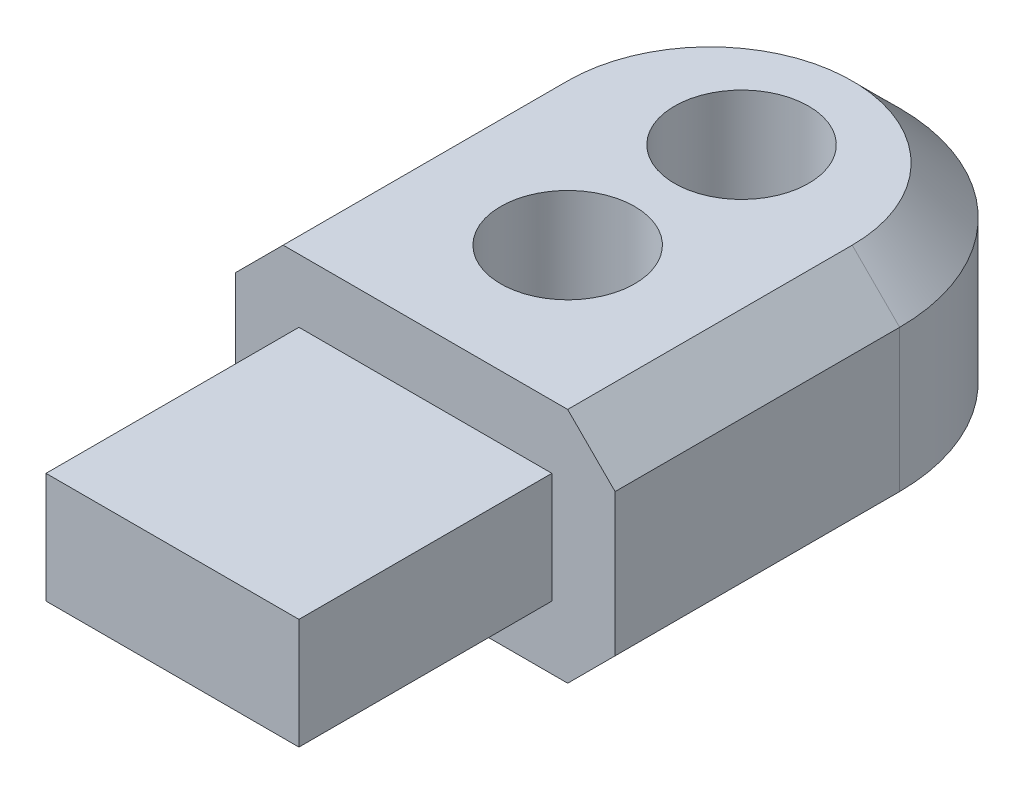
ISO-10303-21;
HEADER;
FILE_DESCRIPTION(('STEP AP214'),'2;1');
FILE_NAME('part.step','',(''),(''),'','','');
FILE_SCHEMA(('AUTOMOTIVE_DESIGN { 1 0 10303 214 1 1 1 1 }'));
ENDSEC;
DATA;
#1=APPLICATION_CONTEXT('core data for automotive mechanical design processes');
#2=APPLICATION_PROTOCOL_DEFINITION('international standard','automotive_design',2000,#1);
#3=PRODUCT_CONTEXT('',#1,'mechanical');
#4=PRODUCT('Part','Part','',(#3));
#5=PRODUCT_RELATED_PRODUCT_CATEGORY('part','',(#4));
#6=PRODUCT_DEFINITION_FORMATION('','',#4);
#7=PRODUCT_DEFINITION_CONTEXT('part definition',#1,'design');
#8=PRODUCT_DEFINITION('design','',#6,#7);
#9=PRODUCT_DEFINITION_SHAPE('','',#8);
#10=(LENGTH_UNIT() NAMED_UNIT(*) SI_UNIT(.MILLI.,.METRE.));
#11=(NAMED_UNIT(*) PLANE_ANGLE_UNIT() SI_UNIT($,.RADIAN.));
#12=(NAMED_UNIT(*) SI_UNIT($,.STERADIAN.) SOLID_ANGLE_UNIT());
#13=UNCERTAINTY_MEASURE_WITH_UNIT(LENGTH_MEASURE(1.E-05),#10,'distance_accuracy_value','');
#14=(GEOMETRIC_REPRESENTATION_CONTEXT(3) GLOBAL_UNCERTAINTY_ASSIGNED_CONTEXT((#13)) GLOBAL_UNIT_ASSIGNED_CONTEXT((#10,
#11,#12)) REPRESENTATION_CONTEXT('',''));
#15=CARTESIAN_POINT('',(0.,0.,0.));
#16=DIRECTION('',(0.,0.,1.));
#17=DIRECTION('',(1.,0.,0.));
#18=AXIS2_PLACEMENT_3D('',#15,#16,#17);
#19=CARTESIAN_POINT('',(7.827828813628,-4.,0.));
#20=DIRECTION('',(-1.,0.,0.));
#21=DIRECTION('',(0.,0.,1.));
#22=AXIS2_PLACEMENT_3D('',#19,#20,#21);
#23=PLANE('',#22);
#24=DIRECTION('',(0.,1.,0.));
#25=VECTOR('',#24,1.);
#26=CARTESIAN_POINT('',(7.827828813628,-4.,29.6199688894745));
#27=LINE('',#26,#25);
#28=CARTESIAN_POINT('',(7.827828813628,-2.5,29.6199688894745));
#29=VERTEX_POINT('',#28);
#30=CARTESIAN_POINT('',(7.827828813628,1.99999999999999,29.6199688894745));
#31=VERTEX_POINT('',#30);
#32=EDGE_CURVE('E170',#29,#31,#27,.T.);
#33=ORIENTED_EDGE('',*,*,#32,.F.);
#34=DIRECTION('',(0.,0.,-1.));
#35=VECTOR('',#34,1.);
#36=CARTESIAN_POINT('',(7.827828813628,-2.5,0.));
#37=LINE('',#36,#35);
#38=CARTESIAN_POINT('',(7.827828813628,-2.5,20.6199688894745));
#39=VERTEX_POINT('',#38);
#40=EDGE_CURVE('E199',#29,#39,#37,.T.);
#41=ORIENTED_EDGE('',*,*,#40,.T.);
#42=DIRECTION('',(0.,1.,0.));
#43=VECTOR('',#42,1.);
#44=CARTESIAN_POINT('',(7.827828813628,-4.,20.6199688894745));
#45=LINE('',#44,#43);
#46=CARTESIAN_POINT('',(7.827828813628,1.99999999999999,20.6199688894745));
#47=VERTEX_POINT('',#46);
#48=EDGE_CURVE('E169',#39,#47,#45,.T.);
#49=ORIENTED_EDGE('',*,*,#48,.T.);
#50=DIRECTION('',(0.,0.,1.));
#51=VECTOR('',#50,1.);
#52=CARTESIAN_POINT('',(7.827828813628,1.99999999999999,29.6199688894745));
#53=LINE('',#52,#51);
#54=EDGE_CURVE('E196',#47,#31,#53,.T.);
#55=ORIENTED_EDGE('',*,*,#54,.T.);
#56=EDGE_LOOP('',(#33,#41,#49,#55));
#57=FACE_BOUND('',#56,.T.);
#58=ADVANCED_FACE('F45',(#57),#23,.F.);
#59=CARTESIAN_POINT('',(0.,-4.,29.6199688894745));
#60=DIRECTION('',(0.,0.,1.));
#61=DIRECTION('',(1.,0.,0.));
#62=AXIS2_PLACEMENT_3D('',#59,#60,#61);
#63=PLANE('',#62);
#64=DIRECTION('',(0.,-1.,0.));
#65=VECTOR('',#64,1.);
#66=CARTESIAN_POINT('',(-2.172171186372,1.5,29.6199688894745));
#67=LINE('',#66,#65);
#68=CARTESIAN_POINT('',(-2.172171186372,1.5,29.6199688894745));
#69=VERTEX_POINT('',#68);
#70=CARTESIAN_POINT('',(-2.172171186372,-2.,29.6199688894745));
#71=VERTEX_POINT('',#70);
#72=EDGE_CURVE('E158',#69,#71,#67,.T.);
#73=ORIENTED_EDGE('',*,*,#72,.F.);
#74=DIRECTION('',(-1.,0.,0.));
#75=VECTOR('',#74,1.);
#76=CARTESIAN_POINT('',(5.827828813628,1.5,29.6199688894745));
#77=LINE('',#76,#75);
#78=CARTESIAN_POINT('',(5.827828813628,1.5,29.6199688894745));
#79=VERTEX_POINT('',#78);
#80=EDGE_CURVE('E155',#79,#69,#77,.T.);
#81=ORIENTED_EDGE('',*,*,#80,.F.);
#82=DIRECTION('',(0.,1.,0.));
#83=VECTOR('',#82,1.);
#84=CARTESIAN_POINT('',(5.827828813628,1.5,29.6199688894745));
#85=LINE('',#84,#83);
#86=CARTESIAN_POINT('',(5.827828813628,-2.,29.6199688894745));
#87=VERTEX_POINT('',#86);
#88=EDGE_CURVE('E239',#87,#79,#85,.T.);
#89=ORIENTED_EDGE('',*,*,#88,.F.);
#90=DIRECTION('',(1.,0.,0.));
#91=VECTOR('',#90,1.);
#92=CARTESIAN_POINT('',(5.827828813628,-2.,29.6199688894745));
#93=LINE('',#92,#91);
#94=EDGE_CURVE('E237',#71,#87,#93,.T.);
#95=ORIENTED_EDGE('',*,*,#94,.F.);
#96=EDGE_LOOP('',(#73,#81,#89,#95));
#97=FACE_BOUND('',#96,.T.);
#98=DIRECTION('',(1.,0.,0.));
#99=VECTOR('',#98,1.);
#100=CARTESIAN_POINT('',(0.,-4.,29.6199688894745));
#101=LINE('',#100,#99);
#102=CARTESIAN_POINT('',(-2.67217118637199,-4.,29.6199688894745));
#103=VERTEX_POINT('',#102);
#104=CARTESIAN_POINT('',(6.327828813628,-4.,29.6199688894745));
#105=VERTEX_POINT('',#104);
#106=EDGE_CURVE('E161',#103,#105,#101,.T.);
#107=ORIENTED_EDGE('',*,*,#106,.T.);
#108=DIRECTION('',(-0.707106781186549,-0.707106781186547,0.));
#109=VECTOR('',#108,1.);
#110=CARTESIAN_POINT('',(3.16391440681399,-7.163914406814,29.6199688894745));
#111=LINE('',#110,#109);
#112=EDGE_CURVE('E194',#105,#29,#111,.F.);
#113=ORIENTED_EDGE('',*,*,#112,.T.);
#114=ORIENTED_EDGE('',*,*,#32,.T.);
#115=DIRECTION('',(-0.707106781186546,0.707106781186549,0.));
#116=VECTOR('',#115,1.);
#117=CARTESIAN_POINT('',(6.91391440681401,2.91391440681398,29.6199688894745));
#118=LINE('',#117,#116);
#119=CARTESIAN_POINT('',(6.327828813628,3.5,29.6199688894745));
#120=VERTEX_POINT('',#119);
#121=EDGE_CURVE('E190',#31,#120,#118,.T.);
#122=ORIENTED_EDGE('',*,*,#121,.T.);
#123=DIRECTION('',(1.,0.,0.));
#124=VECTOR('',#123,1.);
#125=CARTESIAN_POINT('',(0.,3.5,29.6199688894745));
#126=LINE('',#125,#124);
#127=CARTESIAN_POINT('',(-2.672171186372,3.5,29.6199688894745));
#128=VERTEX_POINT('',#127);
#129=EDGE_CURVE('E159',#128,#120,#126,.T.);
#130=ORIENTED_EDGE('',*,*,#129,.F.);
#131=DIRECTION('',(0.707106781186546,0.707106781186549,0.));
#132=VECTOR('',#131,1.);
#133=CARTESIAN_POINT('',(-5.086085593186,1.08608559318598,29.6199688894745));
#134=LINE('',#133,#132);
#135=CARTESIAN_POINT('',(-4.172171186372,1.99999999999999,29.6199688894745));
#136=VERTEX_POINT('',#135);
#137=EDGE_CURVE('E188',#128,#136,#134,.F.);
#138=ORIENTED_EDGE('',*,*,#137,.T.);
#139=DIRECTION('',(0.,1.,0.));
#140=VECTOR('',#139,1.);
#141=CARTESIAN_POINT('',(-4.172171186372,-4.,29.6199688894745));
#142=LINE('',#141,#140);
#143=CARTESIAN_POINT('',(-4.172171186372,-2.5,29.6199688894745));
#144=VERTEX_POINT('',#143);
#145=EDGE_CURVE('E174',#144,#136,#142,.T.);
#146=ORIENTED_EDGE('',*,*,#145,.F.);
#147=DIRECTION('',(0.707106781186549,-0.707106781186547,0.));
#148=VECTOR('',#147,1.);
#149=CARTESIAN_POINT('',(-1.33608559318599,-5.336085593186,29.6199688894745));
#150=LINE('',#149,#148);
#151=EDGE_CURVE('E192',#144,#103,#150,.T.);
#152=ORIENTED_EDGE('',*,*,#151,.T.);
#153=EDGE_LOOP('',(#107,#113,#114,#122,#130,#138,#146,#152));
#154=FACE_BOUND('',#153,.T.);
#155=ADVANCED_FACE('F251',(#97,#154),#63,.T.);
#156=CARTESIAN_POINT('',(-4.172171186372,-4.,0.));
#157=DIRECTION('',(-1.,0.,0.));
#158=DIRECTION('',(0.,0.,1.));
#159=AXIS2_PLACEMENT_3D('',#156,#157,#158);
#160=PLANE('',#159);
#161=DIRECTION('',(0.,1.,0.));
#162=VECTOR('',#161,1.);
#163=CARTESIAN_POINT('',(-4.172171186372,-4.,20.6199688894745));
#164=LINE('',#163,#162);
#165=CARTESIAN_POINT('',(-4.172171186372,-2.5,20.6199688894745));
#166=VERTEX_POINT('',#165);
#167=CARTESIAN_POINT('',(-4.172171186372,1.99999999999999,20.6199688894745));
#168=VERTEX_POINT('',#167);
#169=EDGE_CURVE('E177',#166,#168,#164,.T.);
#170=ORIENTED_EDGE('',*,*,#169,.F.);
#171=DIRECTION('',(0.,0.,1.));
#172=VECTOR('',#171,1.);
#173=CARTESIAN_POINT('',(-4.172171186372,-2.5,29.6199688894745));
#174=LINE('',#173,#172);
#175=EDGE_CURVE('E203',#166,#144,#174,.T.);
#176=ORIENTED_EDGE('',*,*,#175,.T.);
#177=ORIENTED_EDGE('',*,*,#145,.T.);
#178=DIRECTION('',(0.,0.,-1.));
#179=VECTOR('',#178,1.);
#180=CARTESIAN_POINT('',(-4.172171186372,1.99999999999999,0.));
#181=LINE('',#180,#179);
#182=EDGE_CURVE('E201',#136,#168,#181,.T.);
#183=ORIENTED_EDGE('',*,*,#182,.T.);
#184=EDGE_LOOP('',(#170,#176,#177,#183));
#185=FACE_BOUND('',#184,.T.);
#186=ADVANCED_FACE('F254',(#185),#160,.T.);
#187=CARTESIAN_POINT('',(1.827828813628,-4.,20.6199688894745));
#188=DIRECTION('',(0.,1.,0.));
#189=DIRECTION('',(0.,0.,1.));
#190=AXIS2_PLACEMENT_3D('',#187,#188,#189);
#191=CYLINDRICAL_SURFACE('',#190,6.);
#192=ORIENTED_EDGE('',*,*,#48,.F.);
#193=CARTESIAN_POINT('',(1.827828813628,-2.5,20.6199688894745));
#194=DIRECTION('',(0.,1.,0.));
#195=DIRECTION('',(0.,0.,1.));
#196=AXIS2_PLACEMENT_3D('',#193,#194,#195);
#197=CIRCLE('',#196,6.);
#198=EDGE_CURVE('E207',#39,#166,#197,.T.);
#199=ORIENTED_EDGE('',*,*,#198,.T.);
#200=ORIENTED_EDGE('',*,*,#169,.T.);
#201=CARTESIAN_POINT('',(1.827828813628,1.99999999999999,20.6199688894745));
#202=DIRECTION('',(0.,1.,0.));
#203=DIRECTION('',(0.,0.,1.));
#204=AXIS2_PLACEMENT_3D('',#201,#202,#203);
#205=CIRCLE('',#204,6.);
#206=EDGE_CURVE('E205',#168,#47,#205,.F.);
#207=ORIENTED_EDGE('',*,*,#206,.T.);
#208=EDGE_LOOP('',(#192,#199,#200,#207));
#209=FACE_BOUND('',#208,.T.);
#210=ADVANCED_FACE('F279',(#209),#191,.T.);
#211=CARTESIAN_POINT('',(0.,-4.,0.));
#212=DIRECTION('',(0.,1.,0.));
#213=DIRECTION('',(0.,0.,1.));
#214=AXIS2_PLACEMENT_3D('',#211,#212,#213);
#215=PLANE('',#214);
#216=CARTESIAN_POINT('',(1.827828813628,-4.,25.1199688894745));
#217=DIRECTION('',(0.,1.,0.));
#218=DIRECTION('',(0.,0.,1.));
#219=AXIS2_PLACEMENT_3D('',#216,#217,#218);
#220=CIRCLE('',#219,2.12);
#221=CARTESIAN_POINT('',(1.827828813628,-4.,27.2399688894745));
#222=VERTEX_POINT('',#221);
#223=EDGE_CURVE('E218',#222,#222,#220,.T.);
#224=ORIENTED_EDGE('',*,*,#223,.T.);
#225=EDGE_LOOP('',(#224));
#226=FACE_BOUND('',#225,.T.);
#227=CARTESIAN_POINT('',(1.827828813628,-4.,19.6199688894745));
#228=DIRECTION('',(0.,1.,0.));
#229=DIRECTION('',(0.,0.,1.));
#230=AXIS2_PLACEMENT_3D('',#227,#228,#229);
#231=CIRCLE('',#230,2.12);
#232=CARTESIAN_POINT('',(1.827828813628,-4.,21.7399688894745));
#233=VERTEX_POINT('',#232);
#234=EDGE_CURVE('E224',#233,#233,#231,.T.);
#235=ORIENTED_EDGE('',*,*,#234,.T.);
#236=EDGE_LOOP('',(#235));
#237=FACE_BOUND('',#236,.T.);
#238=CARTESIAN_POINT('',(1.827828813628,-4.,20.6199688894745));
#239=DIRECTION('',(0.,1.,0.));
#240=DIRECTION('',(0.,0.,1.));
#241=AXIS2_PLACEMENT_3D('',#238,#239,#240);
#242=CIRCLE('',#241,4.49999999999999);
#243=CARTESIAN_POINT('',(-2.67217118637199,-4.,20.6199688894745));
#244=VERTEX_POINT('',#243);
#245=CARTESIAN_POINT('',(6.32782881362799,-4.,20.6199688894745));
#246=VERTEX_POINT('',#245);
#247=EDGE_CURVE('E173',#244,#246,#242,.F.);
#248=ORIENTED_EDGE('',*,*,#247,.T.);
#249=DIRECTION('',(0.,0.,1.));
#250=VECTOR('',#249,1.);
#251=CARTESIAN_POINT('',(6.32782881362799,-4.,0.));
#252=LINE('',#251,#250);
#253=EDGE_CURVE('E185',#246,#105,#252,.T.);
#254=ORIENTED_EDGE('',*,*,#253,.T.);
#255=ORIENTED_EDGE('',*,*,#106,.F.);
#256=DIRECTION('',(0.,0.,-1.));
#257=VECTOR('',#256,1.);
#258=CARTESIAN_POINT('',(-2.67217118637199,-4.,20.6199688894745));
#259=LINE('',#258,#257);
#260=EDGE_CURVE('E183',#103,#244,#259,.T.);
#261=ORIENTED_EDGE('',*,*,#260,.T.);
#262=EDGE_LOOP('',(#248,#254,#255,#261));
#263=FACE_BOUND('',#262,.T.);
#264=ADVANCED_FACE('F262',(#226,#237,#263),#215,.F.);
#265=CARTESIAN_POINT('',(0.,3.5,0.));
#266=DIRECTION('',(0.,1.,0.));
#267=DIRECTION('',(0.,0.,1.));
#268=AXIS2_PLACEMENT_3D('',#265,#266,#267);
#269=PLANE('',#268);
#270=CARTESIAN_POINT('',(1.827828813628,3.5,25.1199688894745));
#271=DIRECTION('',(0.,-1.,0.));
#272=DIRECTION('',(0.,0.,-1.));
#273=AXIS2_PLACEMENT_3D('',#270,#271,#272);
#274=CIRCLE('',#273,2.12);
#275=CARTESIAN_POINT('',(1.827828813628,3.5,22.9999688894745));
#276=VERTEX_POINT('',#275);
#277=EDGE_CURVE('E229',#276,#276,#274,.T.);
#278=ORIENTED_EDGE('',*,*,#277,.T.);
#279=EDGE_LOOP('',(#278));
#280=FACE_BOUND('',#279,.T.);
#281=CARTESIAN_POINT('',(1.827828813628,3.5,19.6199688894745));
#282=DIRECTION('',(0.,-1.,0.));
#283=DIRECTION('',(0.,0.,-1.));
#284=AXIS2_PLACEMENT_3D('',#281,#282,#283);
#285=CIRCLE('',#284,2.12);
#286=CARTESIAN_POINT('',(1.827828813628,3.5,17.4999688894745));
#287=VERTEX_POINT('',#286);
#288=EDGE_CURVE('E458',#287,#287,#285,.T.);
#289=ORIENTED_EDGE('',*,*,#288,.T.);
#290=EDGE_LOOP('',(#289));
#291=FACE_BOUND('',#290,.T.);
#292=ORIENTED_EDGE('',*,*,#129,.T.);
#293=DIRECTION('',(0.,0.,-1.));
#294=VECTOR('',#293,1.);
#295=CARTESIAN_POINT('',(6.327828813628,3.5,20.6199688894745));
#296=LINE('',#295,#294);
#297=CARTESIAN_POINT('',(6.327828813628,3.5,20.6199688894745));
#298=VERTEX_POINT('',#297);
#299=EDGE_CURVE('E11',#120,#298,#296,.T.);
#300=ORIENTED_EDGE('',*,*,#299,.T.);
#301=CARTESIAN_POINT('',(1.827828813628,3.5,20.6199688894745));
#302=DIRECTION('',(0.,1.,0.));
#303=DIRECTION('',(0.,0.,1.));
#304=AXIS2_PLACEMENT_3D('',#301,#302,#303);
#305=CIRCLE('',#304,4.5);
#306=CARTESIAN_POINT('',(-2.67217118637199,3.5,20.6199688894745));
#307=VERTEX_POINT('',#306);
#308=EDGE_CURVE('E62',#298,#307,#305,.T.);
#309=ORIENTED_EDGE('',*,*,#308,.T.);
#310=DIRECTION('',(0.,0.,1.));
#311=VECTOR('',#310,1.);
#312=CARTESIAN_POINT('',(-2.67217118637199,3.5,0.));
#313=LINE('',#312,#311);
#314=EDGE_CURVE('E55',#307,#128,#313,.T.);
#315=ORIENTED_EDGE('',*,*,#314,.T.);
#316=EDGE_LOOP('',(#292,#300,#309,#315));
#317=FACE_BOUND('',#316,.T.);
#318=ADVANCED_FACE('F288',(#280,#291,#317),#269,.T.);
#319=CARTESIAN_POINT('',(-2.172171186372,1.5,37.6199688894745));
#320=DIRECTION('',(1.,0.,0.));
#321=DIRECTION('',(0.,0.,-1.));
#322=AXIS2_PLACEMENT_3D('',#319,#320,#321);
#323=PLANE('',#322);
#324=ORIENTED_EDGE('',*,*,#72,.T.);
#325=DIRECTION('',(0.,0.,-1.));
#326=VECTOR('',#325,1.);
#327=CARTESIAN_POINT('',(-2.172171186372,-2.,37.6199688894745));
#328=LINE('',#327,#326);
#329=CARTESIAN_POINT('',(-2.172171186372,-2.,37.6199688894745));
#330=VERTEX_POINT('',#329);
#331=EDGE_CURVE('E139',#330,#71,#328,.T.);
#332=ORIENTED_EDGE('',*,*,#331,.F.);
#333=DIRECTION('',(0.,-1.,0.));
#334=VECTOR('',#333,1.);
#335=CARTESIAN_POINT('',(-2.172171186372,1.5,37.6199688894745));
#336=LINE('',#335,#334);
#337=CARTESIAN_POINT('',(-2.172171186372,1.5,37.6199688894745));
#338=VERTEX_POINT('',#337);
#339=EDGE_CURVE('E146',#338,#330,#336,.T.);
#340=ORIENTED_EDGE('',*,*,#339,.F.);
#341=DIRECTION('',(0.,0.,-1.));
#342=VECTOR('',#341,1.);
#343=CARTESIAN_POINT('',(-2.172171186372,1.5,37.6199688894745));
#344=LINE('',#343,#342);
#345=EDGE_CURVE('E235',#338,#69,#344,.T.);
#346=ORIENTED_EDGE('',*,*,#345,.T.);
#347=EDGE_LOOP('',(#324,#332,#340,#346));
#348=FACE_BOUND('',#347,.T.);
#349=ADVANCED_FACE('F157',(#348),#323,.F.);
#350=CARTESIAN_POINT('',(5.827828813628,-2.,37.6199688894745));
#351=DIRECTION('',(0.,1.,0.));
#352=DIRECTION('',(0.,0.,1.));
#353=AXIS2_PLACEMENT_3D('',#350,#351,#352);
#354=PLANE('',#353);
#355=ORIENTED_EDGE('',*,*,#94,.T.);
#356=DIRECTION('',(0.,0.,-1.));
#357=VECTOR('',#356,1.);
#358=CARTESIAN_POINT('',(5.827828813628,-2.,37.6199688894745));
#359=LINE('',#358,#357);
#360=CARTESIAN_POINT('',(5.827828813628,-2.,37.6199688894745));
#361=VERTEX_POINT('',#360);
#362=EDGE_CURVE('E142',#361,#87,#359,.T.);
#363=ORIENTED_EDGE('',*,*,#362,.F.);
#364=DIRECTION('',(1.,0.,0.));
#365=VECTOR('',#364,1.);
#366=CARTESIAN_POINT('',(5.827828813628,-2.,37.6199688894745));
#367=LINE('',#366,#365);
#368=EDGE_CURVE('E134',#330,#361,#367,.T.);
#369=ORIENTED_EDGE('',*,*,#368,.F.);
#370=ORIENTED_EDGE('',*,*,#331,.T.);
#371=EDGE_LOOP('',(#355,#363,#369,#370));
#372=FACE_BOUND('',#371,.T.);
#373=ADVANCED_FACE('F137',(#372),#354,.F.);
#374=CARTESIAN_POINT('',(5.827828813628,1.5,37.6199688894745));
#375=DIRECTION('',(-1.,0.,0.));
#376=DIRECTION('',(0.,0.,1.));
#377=AXIS2_PLACEMENT_3D('',#374,#375,#376);
#378=PLANE('',#377);
#379=ORIENTED_EDGE('',*,*,#88,.T.);
#380=DIRECTION('',(0.,0.,-1.));
#381=VECTOR('',#380,1.);
#382=CARTESIAN_POINT('',(5.827828813628,1.5,37.6199688894745));
#383=LINE('',#382,#381);
#384=CARTESIAN_POINT('',(5.827828813628,1.5,37.6199688894745));
#385=VERTEX_POINT('',#384);
#386=EDGE_CURVE('E163',#385,#79,#383,.T.);
#387=ORIENTED_EDGE('',*,*,#386,.F.);
#388=DIRECTION('',(0.,1.,0.));
#389=VECTOR('',#388,1.);
#390=CARTESIAN_POINT('',(5.827828813628,1.5,37.6199688894745));
#391=LINE('',#390,#389);
#392=EDGE_CURVE('E145',#361,#385,#391,.T.);
#393=ORIENTED_EDGE('',*,*,#392,.F.);
#394=ORIENTED_EDGE('',*,*,#362,.T.);
#395=EDGE_LOOP('',(#379,#387,#393,#394));
#396=FACE_BOUND('',#395,.T.);
#397=ADVANCED_FACE('F249',(#396),#378,.F.);
#398=CARTESIAN_POINT('',(5.827828813628,1.5,37.6199688894745));
#399=DIRECTION('',(0.,-1.,0.));
#400=DIRECTION('',(0.,0.,-1.));
#401=AXIS2_PLACEMENT_3D('',#398,#399,#400);
#402=PLANE('',#401);
#403=ORIENTED_EDGE('',*,*,#80,.T.);
#404=ORIENTED_EDGE('',*,*,#345,.F.);
#405=DIRECTION('',(-1.,0.,0.));
#406=VECTOR('',#405,1.);
#407=CARTESIAN_POINT('',(5.827828813628,1.5,37.6199688894745));
#408=LINE('',#407,#406);
#409=EDGE_CURVE('E151',#385,#338,#408,.T.);
#410=ORIENTED_EDGE('',*,*,#409,.F.);
#411=ORIENTED_EDGE('',*,*,#386,.T.);
#412=EDGE_LOOP('',(#403,#404,#410,#411));
#413=FACE_BOUND('',#412,.T.);
#414=ADVANCED_FACE('F247',(#413),#402,.F.);
#415=CARTESIAN_POINT('',(0.,0.,37.6199688894745));
#416=DIRECTION('',(0.,0.,-1.));
#417=DIRECTION('',(-1.,0.,0.));
#418=AXIS2_PLACEMENT_3D('',#415,#416,#417);
#419=PLANE('',#418);
#420=ORIENTED_EDGE('',*,*,#339,.T.);
#421=ORIENTED_EDGE('',*,*,#368,.T.);
#422=ORIENTED_EDGE('',*,*,#392,.T.);
#423=ORIENTED_EDGE('',*,*,#409,.T.);
#424=EDGE_LOOP('',(#420,#421,#422,#423));
#425=FACE_BOUND('',#424,.T.);
#426=ADVANCED_FACE('F149',(#425),#419,.F.);
#427=CARTESIAN_POINT('',(-4.172171186372,-2.5,0.));
#428=DIRECTION('',(-0.707106781186546,-0.707106781186548,0.));
#429=DIRECTION('',(0.,0.,-1.));
#430=AXIS2_PLACEMENT_3D('',#427,#428,#429);
#431=PLANE('',#430);
#432=ORIENTED_EDGE('',*,*,#151,.F.);
#433=ORIENTED_EDGE('',*,*,#175,.F.);
#434=DIRECTION('',(-0.707106781186549,0.707106781186546,0.));
#435=VECTOR('',#434,1.);
#436=CARTESIAN_POINT('',(-2.67217118637199,-4.,20.6199688894745));
#437=LINE('',#436,#435);
#438=EDGE_CURVE('E214',#244,#166,#437,.T.);
#439=ORIENTED_EDGE('',*,*,#438,.F.);
#440=ORIENTED_EDGE('',*,*,#260,.F.);
#441=EDGE_LOOP('',(#432,#433,#439,#440));
#442=FACE_BOUND('',#441,.T.);
#443=ADVANCED_FACE('F266',(#442),#431,.T.);
#444=CARTESIAN_POINT('',(1.827828813628,-2.5,20.6199688894745));
#445=DIRECTION('',(0.,1.,0.));
#446=DIRECTION('',(0.,0.,1.));
#447=AXIS2_PLACEMENT_3D('',#444,#445,#446);
#448=CONICAL_SURFACE('',#447,6.,0.78539816339745);
#449=ORIENTED_EDGE('',*,*,#438,.T.);
#450=ORIENTED_EDGE('',*,*,#198,.F.);
#451=DIRECTION('',(0.707106781186548,0.707106781186546,0.));
#452=VECTOR('',#451,1.);
#453=CARTESIAN_POINT('',(6.32782881362799,-4.,20.6199688894745));
#454=LINE('',#453,#452);
#455=EDGE_CURVE('E211',#246,#39,#454,.T.);
#456=ORIENTED_EDGE('',*,*,#455,.F.);
#457=ORIENTED_EDGE('',*,*,#247,.F.);
#458=EDGE_LOOP('',(#449,#450,#456,#457));
#459=FACE_BOUND('',#458,.T.);
#460=ADVANCED_FACE('F272',(#459),#448,.T.);
#461=CARTESIAN_POINT('',(6.32782881362799,-4.,0.));
#462=DIRECTION('',(-0.707106781186546,0.707106781186548,0.));
#463=DIRECTION('',(0.,0.,1.));
#464=AXIS2_PLACEMENT_3D('',#461,#462,#463);
#465=PLANE('',#464);
#466=ORIENTED_EDGE('',*,*,#455,.T.);
#467=ORIENTED_EDGE('',*,*,#40,.F.);
#468=ORIENTED_EDGE('',*,*,#112,.F.);
#469=ORIENTED_EDGE('',*,*,#253,.F.);
#470=EDGE_LOOP('',(#466,#467,#468,#469));
#471=FACE_BOUND('',#470,.T.);
#472=ADVANCED_FACE('F275',(#471),#465,.F.);
#473=CARTESIAN_POINT('',(-2.67217118637199,3.5,0.));
#474=DIRECTION('',(0.707106781186549,-0.707106781186546,0.));
#475=DIRECTION('',(0.,0.,1.));
#476=AXIS2_PLACEMENT_3D('',#473,#474,#475);
#477=PLANE('',#476);
#478=ORIENTED_EDGE('',*,*,#137,.F.);
#479=ORIENTED_EDGE('',*,*,#314,.F.);
#480=DIRECTION('',(0.707106781186546,0.707106781186549,0.));
#481=VECTOR('',#480,1.);
#482=CARTESIAN_POINT('',(-4.172171186372,1.99999999999999,20.6199688894745));
#483=LINE('',#482,#481);
#484=EDGE_CURVE('E50',#168,#307,#483,.T.);
#485=ORIENTED_EDGE('',*,*,#484,.F.);
#486=ORIENTED_EDGE('',*,*,#182,.F.);
#487=EDGE_LOOP('',(#478,#479,#485,#486));
#488=FACE_BOUND('',#487,.T.);
#489=ADVANCED_FACE('F48',(#488),#477,.F.);
#490=CARTESIAN_POINT('',(1.827828813628,3.5,20.6199688894745));
#491=DIRECTION('',(0.,-1.,0.));
#492=DIRECTION('',(0.,0.,-1.));
#493=AXIS2_PLACEMENT_3D('',#490,#491,#492);
#494=CONICAL_SURFACE('',#493,4.5,0.785398163397447);
#495=ORIENTED_EDGE('',*,*,#484,.T.);
#496=ORIENTED_EDGE('',*,*,#308,.F.);
#497=DIRECTION('',(-0.707106781186546,0.707106781186549,0.));
#498=VECTOR('',#497,1.);
#499=CARTESIAN_POINT('',(7.827828813628,1.99999999999999,20.6199688894745));
#500=LINE('',#499,#498);
#501=EDGE_CURVE('E216',#47,#298,#500,.T.);
#502=ORIENTED_EDGE('',*,*,#501,.F.);
#503=ORIENTED_EDGE('',*,*,#206,.F.);
#504=EDGE_LOOP('',(#495,#496,#502,#503));
#505=FACE_BOUND('',#504,.T.);
#506=ADVANCED_FACE('F284',(#505),#494,.T.);
#507=CARTESIAN_POINT('',(7.827828813628,1.99999999999999,0.));
#508=DIRECTION('',(0.707106781186549,0.707106781186546,0.));
#509=DIRECTION('',(0.,0.,-1.));
#510=AXIS2_PLACEMENT_3D('',#507,#508,#509);
#511=PLANE('',#510);
#512=ORIENTED_EDGE('',*,*,#501,.T.);
#513=ORIENTED_EDGE('',*,*,#299,.F.);
#514=ORIENTED_EDGE('',*,*,#121,.F.);
#515=ORIENTED_EDGE('',*,*,#54,.F.);
#516=EDGE_LOOP('',(#512,#513,#514,#515));
#517=FACE_BOUND('',#516,.T.);
#518=ADVANCED_FACE('F285',(#517),#511,.T.);
#519=CARTESIAN_POINT('',(1.827828813628,3.5,19.6199688894745));
#520=DIRECTION('',(0.,-1.,0.));
#521=DIRECTION('',(0.,0.,-1.));
#522=AXIS2_PLACEMENT_3D('',#519,#520,#521);
#523=CYLINDRICAL_SURFACE('',#522,2.12);
#524=ORIENTED_EDGE('',*,*,#288,.F.);
#525=EDGE_LOOP('',(#524));
#526=FACE_BOUND('',#525,.T.);
#527=ORIENTED_EDGE('',*,*,#234,.F.);
#528=EDGE_LOOP('',(#527));
#529=FACE_BOUND('',#528,.T.);
#530=ADVANCED_FACE('F324',(#526,#529),#523,.F.);
#531=CARTESIAN_POINT('',(1.827828813628,3.5,25.1199688894745));
#532=DIRECTION('',(0.,-1.,0.));
#533=DIRECTION('',(0.,0.,-1.));
#534=AXIS2_PLACEMENT_3D('',#531,#532,#533);
#535=CYLINDRICAL_SURFACE('',#534,2.12);
#536=ORIENTED_EDGE('',*,*,#277,.F.);
#537=EDGE_LOOP('',(#536));
#538=FACE_BOUND('',#537,.T.);
#539=ORIENTED_EDGE('',*,*,#223,.F.);
#540=EDGE_LOOP('',(#539));
#541=FACE_BOUND('',#540,.T.);
#542=ADVANCED_FACE('F441',(#538,#541),#535,.F.);
#543=CLOSED_SHELL('',(#58,#155,#186,#210,#264,#318,#349,#373,#397,#414,#426,#443,#460,#472,#489,
#506,#518,#530,#542));
#544=MANIFOLD_SOLID_BREP('B2',#543);
#545=ADVANCED_BREP_SHAPE_REPRESENTATION('',(#18,#544),#14);
#546=SHAPE_DEFINITION_REPRESENTATION(#9,#545);
ENDSEC;
END-ISO-10303-21;
